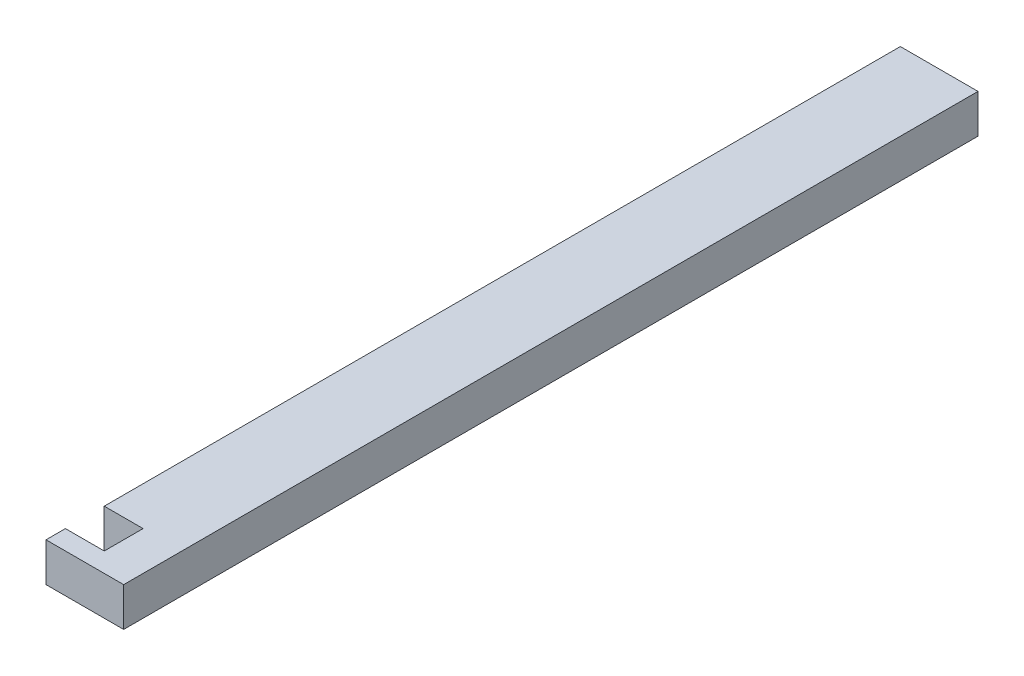
ISO-10303-21;
HEADER;
FILE_DESCRIPTION(('STEP AP214'),'2;1');
FILE_NAME('part.step','',(''),(''),'','','');
FILE_SCHEMA(('AUTOMOTIVE_DESIGN { 1 0 10303 214 1 1 1 1 }'));
ENDSEC;
DATA;
#1=APPLICATION_CONTEXT('core data for automotive mechanical design processes');
#2=APPLICATION_PROTOCOL_DEFINITION('international standard','automotive_design',2000,#1);
#3=PRODUCT_CONTEXT('',#1,'mechanical');
#4=PRODUCT('Part','Part','',(#3));
#5=PRODUCT_RELATED_PRODUCT_CATEGORY('part','',(#4));
#6=PRODUCT_DEFINITION_FORMATION('','',#4);
#7=PRODUCT_DEFINITION_CONTEXT('part definition',#1,'design');
#8=PRODUCT_DEFINITION('design','',#6,#7);
#9=PRODUCT_DEFINITION_SHAPE('','',#8);
#10=(LENGTH_UNIT() NAMED_UNIT(*) SI_UNIT(.MILLI.,.METRE.));
#11=(NAMED_UNIT(*) PLANE_ANGLE_UNIT() SI_UNIT($,.RADIAN.));
#12=(NAMED_UNIT(*) SI_UNIT($,.STERADIAN.) SOLID_ANGLE_UNIT());
#13=UNCERTAINTY_MEASURE_WITH_UNIT(LENGTH_MEASURE(1.E-05),#10,'distance_accuracy_value','');
#14=(GEOMETRIC_REPRESENTATION_CONTEXT(3) GLOBAL_UNCERTAINTY_ASSIGNED_CONTEXT((#13)) GLOBAL_UNIT_ASSIGNED_CONTEXT((#10,
#11,#12)) REPRESENTATION_CONTEXT('',''));
#15=CARTESIAN_POINT('',(0.,0.,0.));
#16=DIRECTION('',(0.,0.,1.));
#17=DIRECTION('',(1.,0.,0.));
#18=AXIS2_PLACEMENT_3D('',#15,#16,#17);
#19=CARTESIAN_POINT('',(-50.8,-25.4,1219.2));
#20=DIRECTION('',(1.,0.,0.));
#21=DIRECTION('',(0.,0.,-1.));
#22=AXIS2_PLACEMENT_3D('',#19,#20,#21);
#23=PLANE('',#22);
#24=DIRECTION('',(0.,0.,-1.));
#25=VECTOR('',#24,1.);
#26=CARTESIAN_POINT('',(-50.8,25.4,1219.2));
#27=LINE('',#26,#25);
#28=CARTESIAN_POINT('',(-50.8,25.4,1117.6));
#29=VERTEX_POINT('',#28);
#30=CARTESIAN_POINT('',(-50.8,25.4,1092.2));
#31=VERTEX_POINT('',#30);
#32=EDGE_CURVE('E51',#29,#31,#27,.T.);
#33=ORIENTED_EDGE('',*,*,#32,.T.);
#34=DIRECTION('',(0.,1.,0.));
#35=VECTOR('',#34,1.);
#36=CARTESIAN_POINT('',(-50.8,25.4,1092.2));
#37=LINE('',#36,#35);
#38=CARTESIAN_POINT('',(-50.8,-25.4,1092.2));
#39=VERTEX_POINT('',#38);
#40=EDGE_CURVE('E112',#39,#31,#37,.T.);
#41=ORIENTED_EDGE('',*,*,#40,.F.);
#42=DIRECTION('',(0.,0.,-1.));
#43=VECTOR('',#42,1.);
#44=CARTESIAN_POINT('',(-50.8,-25.4,1219.2));
#45=LINE('',#44,#43);
#46=CARTESIAN_POINT('',(-50.8,-25.4,1117.6));
#47=VERTEX_POINT('',#46);
#48=EDGE_CURVE('E163',#47,#39,#45,.T.);
#49=ORIENTED_EDGE('',*,*,#48,.F.);
#50=DIRECTION('',(0.,-1.,0.));
#51=VECTOR('',#50,1.);
#52=CARTESIAN_POINT('',(-50.8,25.4,1117.6));
#53=LINE('',#52,#51);
#54=EDGE_CURVE('E66',#29,#47,#53,.T.);
#55=ORIENTED_EDGE('',*,*,#54,.F.);
#56=EDGE_LOOP('',(#33,#41,#49,#55));
#57=FACE_BOUND('',#56,.T.);
#58=ADVANCED_FACE('F43',(#57),#23,.F.);
#59=CARTESIAN_POINT('',(50.8,-25.4,1219.2));
#60=DIRECTION('',(-1.,0.,0.));
#61=DIRECTION('',(0.,0.,1.));
#62=AXIS2_PLACEMENT_3D('',#59,#60,#61);
#63=PLANE('',#62);
#64=DIRECTION('',(0.,1.,0.));
#65=VECTOR('',#64,1.);
#66=CARTESIAN_POINT('',(50.8,-25.4,1117.6));
#67=LINE('',#66,#65);
#68=CARTESIAN_POINT('',(50.8,-25.4,1117.6));
#69=VERTEX_POINT('',#68);
#70=CARTESIAN_POINT('',(50.8,25.4,1117.6));
#71=VERTEX_POINT('',#70);
#72=EDGE_CURVE('E143',#69,#71,#67,.T.);
#73=ORIENTED_EDGE('',*,*,#72,.F.);
#74=DIRECTION('',(0.,0.,-1.));
#75=VECTOR('',#74,1.);
#76=CARTESIAN_POINT('',(50.8,-25.4,1219.2));
#77=LINE('',#76,#75);
#78=CARTESIAN_POINT('',(50.8,-25.4,0.));
#79=VERTEX_POINT('',#78);
#80=EDGE_CURVE('E160',#69,#79,#77,.T.);
#81=ORIENTED_EDGE('',*,*,#80,.T.);
#82=DIRECTION('',(0.,1.,0.));
#83=VECTOR('',#82,1.);
#84=CARTESIAN_POINT('',(50.8,-25.4,0.));
#85=LINE('',#84,#83);
#86=CARTESIAN_POINT('',(50.8,25.4,0.));
#87=VERTEX_POINT('',#86);
#88=EDGE_CURVE('E148',#79,#87,#85,.T.);
#89=ORIENTED_EDGE('',*,*,#88,.T.);
#90=DIRECTION('',(0.,0.,-1.));
#91=VECTOR('',#90,1.);
#92=CARTESIAN_POINT('',(50.8,25.4,1219.2));
#93=LINE('',#92,#91);
#94=EDGE_CURVE('E11',#71,#87,#93,.T.);
#95=ORIENTED_EDGE('',*,*,#94,.F.);
#96=EDGE_LOOP('',(#73,#81,#89,#95));
#97=FACE_BOUND('',#96,.T.);
#98=ADVANCED_FACE('F45',(#97),#63,.F.);
#99=CARTESIAN_POINT('',(-50.8,25.4,1219.2));
#100=DIRECTION('',(0.,-1.,0.));
#101=DIRECTION('',(0.,0.,-1.));
#102=AXIS2_PLACEMENT_3D('',#99,#100,#101);
#103=PLANE('',#102);
#104=DIRECTION('',(0.,0.,-1.));
#105=VECTOR('',#104,1.);
#106=CARTESIAN_POINT('',(0.,25.4,1092.2));
#107=LINE('',#106,#105);
#108=CARTESIAN_POINT('',(0.,25.4,1092.2));
#109=VERTEX_POINT('',#108);
#110=CARTESIAN_POINT('',(0.,25.4,1041.4));
#111=VERTEX_POINT('',#110);
#112=EDGE_CURVE('E121',#109,#111,#107,.T.);
#113=ORIENTED_EDGE('',*,*,#112,.F.);
#114=DIRECTION('',(-1.,0.,0.));
#115=VECTOR('',#114,1.);
#116=CARTESIAN_POINT('',(0.,25.4,1092.2));
#117=LINE('',#116,#115);
#118=EDGE_CURVE('E107',#109,#31,#117,.T.);
#119=ORIENTED_EDGE('',*,*,#118,.T.);
#120=ORIENTED_EDGE('',*,*,#32,.F.);
#121=DIRECTION('',(-1.,0.,0.));
#122=VECTOR('',#121,1.);
#123=CARTESIAN_POINT('',(50.8,25.4,1117.6));
#124=LINE('',#123,#122);
#125=EDGE_CURVE('E145',#71,#29,#124,.T.);
#126=ORIENTED_EDGE('',*,*,#125,.F.);
#127=ORIENTED_EDGE('',*,*,#94,.T.);
#128=DIRECTION('',(-1.,0.,0.));
#129=VECTOR('',#128,1.);
#130=CARTESIAN_POINT('',(-50.8,25.4,0.));
#131=LINE('',#130,#129);
#132=CARTESIAN_POINT('',(-50.8,25.4,0.));
#133=VERTEX_POINT('',#132);
#134=EDGE_CURVE('E151',#87,#133,#131,.T.);
#135=ORIENTED_EDGE('',*,*,#134,.T.);
#136=CARTESIAN_POINT('',(-50.8,25.4,1041.4));
#137=VERTEX_POINT('',#136);
#138=EDGE_CURVE('E165',#137,#133,#27,.T.);
#139=ORIENTED_EDGE('',*,*,#138,.F.);
#140=DIRECTION('',(-1.,0.,0.));
#141=VECTOR('',#140,1.);
#142=CARTESIAN_POINT('',(0.,25.4,1041.4));
#143=LINE('',#142,#141);
#144=EDGE_CURVE('E117',#111,#137,#143,.T.);
#145=ORIENTED_EDGE('',*,*,#144,.F.);
#146=EDGE_LOOP('',(#113,#119,#120,#126,#127,#135,#139,#145));
#147=FACE_BOUND('',#146,.T.);
#148=ADVANCED_FACE('F127',(#147),#103,.F.);
#149=CARTESIAN_POINT('',(-50.8,-25.4,1041.4));
#150=VERTEX_POINT('',#149);
#151=CARTESIAN_POINT('',(-50.8,-25.4,0.));
#152=VERTEX_POINT('',#151);
#153=EDGE_CURVE('E162',#150,#152,#45,.T.);
#154=ORIENTED_EDGE('',*,*,#153,.F.);
#155=DIRECTION('',(0.,-1.,0.));
#156=VECTOR('',#155,1.);
#157=CARTESIAN_POINT('',(-50.8,25.4,1041.4));
#158=LINE('',#157,#156);
#159=EDGE_CURVE('E125',#137,#150,#158,.T.);
#160=ORIENTED_EDGE('',*,*,#159,.F.);
#161=ORIENTED_EDGE('',*,*,#138,.T.);
#162=DIRECTION('',(0.,-1.,0.));
#163=VECTOR('',#162,1.);
#164=CARTESIAN_POINT('',(-50.8,-25.4,0.));
#165=LINE('',#164,#163);
#166=EDGE_CURVE('E154',#133,#152,#165,.T.);
#167=ORIENTED_EDGE('',*,*,#166,.T.);
#168=EDGE_LOOP('',(#154,#160,#161,#167));
#169=FACE_BOUND('',#168,.T.);
#170=ADVANCED_FACE('F170',(#169),#23,.F.);
#171=CARTESIAN_POINT('',(-50.8,-25.4,1219.2));
#172=DIRECTION('',(0.,1.,0.));
#173=DIRECTION('',(0.,0.,1.));
#174=AXIS2_PLACEMENT_3D('',#171,#172,#173);
#175=PLANE('',#174);
#176=ORIENTED_EDGE('',*,*,#48,.T.);
#177=DIRECTION('',(-1.,0.,0.));
#178=VECTOR('',#177,1.);
#179=CARTESIAN_POINT('',(0.,-25.4,1092.2));
#180=LINE('',#179,#178);
#181=CARTESIAN_POINT('',(0.,-25.4,1092.2));
#182=VERTEX_POINT('',#181);
#183=EDGE_CURVE('E135',#182,#39,#180,.T.);
#184=ORIENTED_EDGE('',*,*,#183,.F.);
#185=DIRECTION('',(0.,0.,1.));
#186=VECTOR('',#185,1.);
#187=CARTESIAN_POINT('',(0.,-25.4,1092.2));
#188=LINE('',#187,#186);
#189=CARTESIAN_POINT('',(0.,-25.4,1041.4));
#190=VERTEX_POINT('',#189);
#191=EDGE_CURVE('E118',#190,#182,#188,.T.);
#192=ORIENTED_EDGE('',*,*,#191,.F.);
#193=DIRECTION('',(-1.,0.,0.));
#194=VECTOR('',#193,1.);
#195=CARTESIAN_POINT('',(0.,-25.4,1041.4));
#196=LINE('',#195,#194);
#197=EDGE_CURVE('E138',#190,#150,#196,.T.);
#198=ORIENTED_EDGE('',*,*,#197,.T.);
#199=ORIENTED_EDGE('',*,*,#153,.T.);
#200=DIRECTION('',(1.,0.,0.));
#201=VECTOR('',#200,1.);
#202=CARTESIAN_POINT('',(-50.8,-25.4,0.));
#203=LINE('',#202,#201);
#204=EDGE_CURVE('E157',#152,#79,#203,.T.);
#205=ORIENTED_EDGE('',*,*,#204,.T.);
#206=ORIENTED_EDGE('',*,*,#80,.F.);
#207=DIRECTION('',(1.,0.,0.));
#208=VECTOR('',#207,1.);
#209=CARTESIAN_POINT('',(-50.8,-25.4,1117.6));
#210=LINE('',#209,#208);
#211=EDGE_CURVE('E137',#47,#69,#210,.T.);
#212=ORIENTED_EDGE('',*,*,#211,.F.);
#213=EDGE_LOOP('',(#176,#184,#192,#198,#199,#205,#206,#212));
#214=FACE_BOUND('',#213,.T.);
#215=ADVANCED_FACE('F181',(#214),#175,.F.);
#216=CARTESIAN_POINT('',(0.,0.,0.));
#217=DIRECTION('',(0.,0.,-1.));
#218=DIRECTION('',(-1.,0.,0.));
#219=AXIS2_PLACEMENT_3D('',#216,#217,#218);
#220=PLANE('',#219);
#221=ORIENTED_EDGE('',*,*,#88,.F.);
#222=ORIENTED_EDGE('',*,*,#204,.F.);
#223=ORIENTED_EDGE('',*,*,#166,.F.);
#224=ORIENTED_EDGE('',*,*,#134,.F.);
#225=EDGE_LOOP('',(#221,#222,#223,#224));
#226=FACE_BOUND('',#225,.T.);
#227=ADVANCED_FACE('F178',(#226),#220,.T.);
#228=CARTESIAN_POINT('',(0.,0.,1117.6));
#229=DIRECTION('',(0.,0.,1.));
#230=DIRECTION('',(1.,0.,0.));
#231=AXIS2_PLACEMENT_3D('',#228,#229,#230);
#232=PLANE('',#231);
#233=ORIENTED_EDGE('',*,*,#211,.T.);
#234=ORIENTED_EDGE('',*,*,#72,.T.);
#235=ORIENTED_EDGE('',*,*,#125,.T.);
#236=ORIENTED_EDGE('',*,*,#54,.T.);
#237=EDGE_LOOP('',(#233,#234,#235,#236));
#238=FACE_BOUND('',#237,.T.);
#239=ADVANCED_FACE('F191',(#238),#232,.T.);
#240=CARTESIAN_POINT('',(0.,25.4,1092.2));
#241=DIRECTION('',(0.,0.,1.));
#242=DIRECTION('',(1.,0.,0.));
#243=AXIS2_PLACEMENT_3D('',#240,#241,#242);
#244=PLANE('',#243);
#245=ORIENTED_EDGE('',*,*,#40,.T.);
#246=ORIENTED_EDGE('',*,*,#118,.F.);
#247=DIRECTION('',(0.,1.,0.));
#248=VECTOR('',#247,1.);
#249=CARTESIAN_POINT('',(0.,25.4,1092.2));
#250=LINE('',#249,#248);
#251=EDGE_CURVE('E110',#182,#109,#250,.T.);
#252=ORIENTED_EDGE('',*,*,#251,.F.);
#253=ORIENTED_EDGE('',*,*,#183,.T.);
#254=EDGE_LOOP('',(#245,#246,#252,#253));
#255=FACE_BOUND('',#254,.T.);
#256=ADVANCED_FACE('F109',(#255),#244,.F.);
#257=CARTESIAN_POINT('',(0.,25.4,1041.4));
#258=DIRECTION('',(0.,0.,-1.));
#259=DIRECTION('',(-1.,0.,0.));
#260=AXIS2_PLACEMENT_3D('',#257,#258,#259);
#261=PLANE('',#260);
#262=ORIENTED_EDGE('',*,*,#159,.T.);
#263=ORIENTED_EDGE('',*,*,#197,.F.);
#264=DIRECTION('',(0.,-1.,0.));
#265=VECTOR('',#264,1.);
#266=CARTESIAN_POINT('',(0.,25.4,1041.4));
#267=LINE('',#266,#265);
#268=EDGE_CURVE('E58',#111,#190,#267,.T.);
#269=ORIENTED_EDGE('',*,*,#268,.F.);
#270=ORIENTED_EDGE('',*,*,#144,.T.);
#271=EDGE_LOOP('',(#262,#263,#269,#270));
#272=FACE_BOUND('',#271,.T.);
#273=ADVANCED_FACE('F183',(#272),#261,.F.);
#274=CARTESIAN_POINT('',(0.,0.,0.));
#275=DIRECTION('',(1.,0.,0.));
#276=DIRECTION('',(0.,0.,-1.));
#277=AXIS2_PLACEMENT_3D('',#274,#275,#276);
#278=PLANE('',#277);
#279=ORIENTED_EDGE('',*,*,#251,.T.);
#280=ORIENTED_EDGE('',*,*,#112,.T.);
#281=ORIENTED_EDGE('',*,*,#268,.T.);
#282=ORIENTED_EDGE('',*,*,#191,.T.);
#283=EDGE_LOOP('',(#279,#280,#281,#282));
#284=FACE_BOUND('',#283,.T.);
#285=ADVANCED_FACE('F120',(#284),#278,.F.);
#286=CLOSED_SHELL('',(#58,#98,#148,#170,#215,#227,#239,#256,#273,#285));
#287=MANIFOLD_SOLID_BREP('B2',#286);
#288=ADVANCED_BREP_SHAPE_REPRESENTATION('',(#18,#287),#14);
#289=SHAPE_DEFINITION_REPRESENTATION(#9,#288);
ENDSEC;
END-ISO-10303-21;
